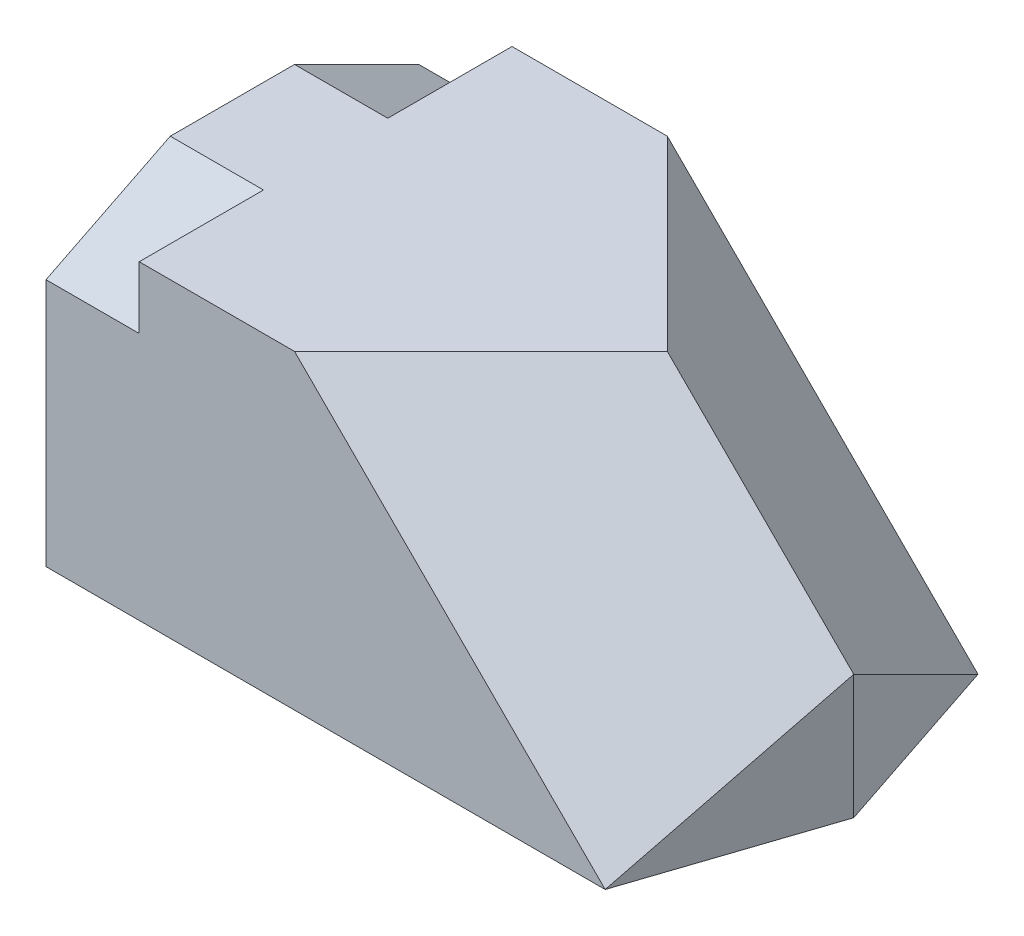
ISO-10303-21;
HEADER;
FILE_DESCRIPTION(('STEP AP214'),'2;1');
FILE_NAME('part.step','',(''),(''),'','','');
FILE_SCHEMA(('AUTOMOTIVE_DESIGN { 1 0 10303 214 1 1 1 1 }'));
ENDSEC;
DATA;
#1=APPLICATION_CONTEXT('core data for automotive mechanical design processes');
#2=APPLICATION_PROTOCOL_DEFINITION('international standard','automotive_design',2000,#1);
#3=PRODUCT_CONTEXT('',#1,'mechanical');
#4=PRODUCT('Part','Part','',(#3));
#5=PRODUCT_RELATED_PRODUCT_CATEGORY('part','',(#4));
#6=PRODUCT_DEFINITION_FORMATION('','',#4);
#7=PRODUCT_DEFINITION_CONTEXT('part definition',#1,'design');
#8=PRODUCT_DEFINITION('design','',#6,#7);
#9=PRODUCT_DEFINITION_SHAPE('','',#8);
#10=(LENGTH_UNIT() NAMED_UNIT(*) SI_UNIT(.MILLI.,.METRE.));
#11=(NAMED_UNIT(*) PLANE_ANGLE_UNIT() SI_UNIT($,.RADIAN.));
#12=(NAMED_UNIT(*) SI_UNIT($,.STERADIAN.) SOLID_ANGLE_UNIT());
#13=UNCERTAINTY_MEASURE_WITH_UNIT(LENGTH_MEASURE(1.E-05),#10,'distance_accuracy_value','');
#14=(GEOMETRIC_REPRESENTATION_CONTEXT(3) GLOBAL_UNCERTAINTY_ASSIGNED_CONTEXT((#13)) GLOBAL_UNIT_ASSIGNED_CONTEXT((#10,
#11,#12)) REPRESENTATION_CONTEXT('',''));
#15=CARTESIAN_POINT('',(0.,0.,0.));
#16=DIRECTION('',(0.,0.,1.));
#17=DIRECTION('',(1.,0.,0.));
#18=AXIS2_PLACEMENT_3D('',#15,#16,#17);
#19=CARTESIAN_POINT('',(0.,0.,30.));
#20=DIRECTION('',(0.,1.,0.));
#21=DIRECTION('',(0.,0.,1.));
#22=AXIS2_PLACEMENT_3D('',#19,#20,#21);
#23=PLANE('',#22);
#24=DIRECTION('',(1.,0.,0.));
#25=VECTOR('',#24,1.);
#26=CARTESIAN_POINT('',(0.,0.,-30.));
#27=LINE('',#26,#25);
#28=CARTESIAN_POINT('',(0.,0.,-30.));
#29=VERTEX_POINT('',#28);
#30=CARTESIAN_POINT('',(90.,0.,-30.));
#31=VERTEX_POINT('',#30);
#32=EDGE_CURVE('E182',#29,#31,#27,.T.);
#33=ORIENTED_EDGE('',*,*,#32,.T.);
#34=DIRECTION('',(-0.316227766016838,0.,-0.948683298050514));
#35=VECTOR('',#34,1.);
#36=CARTESIAN_POINT('',(100.,0.,0.));
#37=LINE('',#36,#35);
#38=CARTESIAN_POINT('',(100.,0.,0.));
#39=VERTEX_POINT('',#38);
#40=EDGE_CURVE('E153',#39,#31,#37,.T.);
#41=ORIENTED_EDGE('',*,*,#40,.F.);
#42=DIRECTION('',(-0.316227766016838,0.,0.948683298050514));
#43=VECTOR('',#42,1.);
#44=CARTESIAN_POINT('',(100.,0.,0.));
#45=LINE('',#44,#43);
#46=CARTESIAN_POINT('',(90.,0.,30.));
#47=VERTEX_POINT('',#46);
#48=EDGE_CURVE('E160',#39,#47,#45,.T.);
#49=ORIENTED_EDGE('',*,*,#48,.T.);
#50=DIRECTION('',(1.,0.,0.));
#51=VECTOR('',#50,1.);
#52=CARTESIAN_POINT('',(0.,0.,30.));
#53=LINE('',#52,#51);
#54=CARTESIAN_POINT('',(0.,0.,30.));
#55=VERTEX_POINT('',#54);
#56=EDGE_CURVE('E173',#55,#47,#53,.T.);
#57=ORIENTED_EDGE('',*,*,#56,.F.);
#58=DIRECTION('',(0.,0.,-1.));
#59=VECTOR('',#58,1.);
#60=CARTESIAN_POINT('',(0.,0.,30.));
#61=LINE('',#60,#59);
#62=EDGE_CURVE('E188',#55,#29,#61,.T.);
#63=ORIENTED_EDGE('',*,*,#62,.T.);
#64=EDGE_LOOP('',(#33,#41,#49,#57,#63));
#65=FACE_BOUND('',#64,.T.);
#66=ADVANCED_FACE('F39',(#65),#23,.F.);
#67=CARTESIAN_POINT('',(0.,50.,30.));
#68=DIRECTION('',(0.,-1.,0.));
#69=DIRECTION('',(0.,0.,-1.));
#70=AXIS2_PLACEMENT_3D('',#67,#68,#69);
#71=PLANE('',#70);
#72=DIRECTION('',(0.,0.,-1.));
#73=VECTOR('',#72,1.);
#74=CARTESIAN_POINT('',(15.,50.,-10.));
#75=LINE('',#74,#73);
#76=CARTESIAN_POINT('',(15.,50.,-10.));
#77=VERTEX_POINT('',#76);
#78=CARTESIAN_POINT('',(15.,50.,-30.));
#79=VERTEX_POINT('',#78);
#80=EDGE_CURVE('E62',#77,#79,#75,.T.);
#81=ORIENTED_EDGE('',*,*,#80,.F.);
#82=DIRECTION('',(-1.,0.,0.));
#83=VECTOR('',#82,1.);
#84=CARTESIAN_POINT('',(15.,50.,-10.));
#85=LINE('',#84,#83);
#86=CARTESIAN_POINT('',(0.,50.,-10.));
#87=VERTEX_POINT('',#86);
#88=EDGE_CURVE('E120',#77,#87,#85,.T.);
#89=ORIENTED_EDGE('',*,*,#88,.T.);
#90=DIRECTION('',(0.,0.,-1.));
#91=VECTOR('',#90,1.);
#92=CARTESIAN_POINT('',(0.,50.,30.));
#93=LINE('',#92,#91);
#94=CARTESIAN_POINT('',(0.,50.,10.));
#95=VERTEX_POINT('',#94);
#96=EDGE_CURVE('E180',#95,#87,#93,.T.);
#97=ORIENTED_EDGE('',*,*,#96,.F.);
#98=DIRECTION('',(-1.,0.,0.));
#99=VECTOR('',#98,1.);
#100=CARTESIAN_POINT('',(15.,50.,10.));
#101=LINE('',#100,#99);
#102=CARTESIAN_POINT('',(15.,50.,10.));
#103=VERTEX_POINT('',#102);
#104=EDGE_CURVE('E54',#103,#95,#101,.T.);
#105=ORIENTED_EDGE('',*,*,#104,.F.);
#106=DIRECTION('',(0.,0.,-1.));
#107=VECTOR('',#106,1.);
#108=CARTESIAN_POINT('',(15.,50.,10.));
#109=LINE('',#108,#107);
#110=CARTESIAN_POINT('',(15.,50.,30.));
#111=VERTEX_POINT('',#110);
#112=EDGE_CURVE('E141',#111,#103,#109,.T.);
#113=ORIENTED_EDGE('',*,*,#112,.F.);
#114=DIRECTION('',(-1.,0.,0.));
#115=VECTOR('',#114,1.);
#116=CARTESIAN_POINT('',(0.,50.,30.));
#117=LINE('',#116,#115);
#118=CARTESIAN_POINT('',(40.,50.,30.));
#119=VERTEX_POINT('',#118);
#120=EDGE_CURVE('E177',#119,#111,#117,.T.);
#121=ORIENTED_EDGE('',*,*,#120,.F.);
#122=DIRECTION('',(0.707106781186548,0.,-0.707106781186548));
#123=VECTOR('',#122,1.);
#124=CARTESIAN_POINT('',(35.,50.,35.));
#125=LINE('',#124,#123);
#126=CARTESIAN_POINT('',(70.,50.,0.));
#127=VERTEX_POINT('',#126);
#128=EDGE_CURVE('E166',#119,#127,#125,.T.);
#129=ORIENTED_EDGE('',*,*,#128,.T.);
#130=DIRECTION('',(0.707106781186548,0.,0.707106781186548));
#131=VECTOR('',#130,1.);
#132=CARTESIAN_POINT('',(35.,50.,-35.));
#133=LINE('',#132,#131);
#134=CARTESIAN_POINT('',(40.,50.,-30.));
#135=VERTEX_POINT('',#134);
#136=EDGE_CURVE('E163',#135,#127,#133,.T.);
#137=ORIENTED_EDGE('',*,*,#136,.F.);
#138=DIRECTION('',(-1.,0.,0.));
#139=VECTOR('',#138,1.);
#140=CARTESIAN_POINT('',(0.,50.,-30.));
#141=LINE('',#140,#139);
#142=EDGE_CURVE('E174',#135,#79,#141,.T.);
#143=ORIENTED_EDGE('',*,*,#142,.T.);
#144=EDGE_LOOP('',(#81,#89,#97,#105,#113,#121,#129,#137,#143));
#145=FACE_BOUND('',#144,.T.);
#146=ADVANCED_FACE('F197',(#145),#71,.F.);
#147=CARTESIAN_POINT('',(0.,0.,30.));
#148=DIRECTION('',(0.,0.,-1.));
#149=DIRECTION('',(-1.,0.,0.));
#150=AXIS2_PLACEMENT_3D('',#147,#148,#149);
#151=PLANE('',#150);
#152=DIRECTION('',(0.,1.,0.));
#153=VECTOR('',#152,1.);
#154=CARTESIAN_POINT('',(15.,50.,30.));
#155=LINE('',#154,#153);
#156=CARTESIAN_POINT('',(15.,40.,30.));
#157=VERTEX_POINT('',#156);
#158=EDGE_CURVE('E139',#157,#111,#155,.T.);
#159=ORIENTED_EDGE('',*,*,#158,.F.);
#160=DIRECTION('',(-1.,0.,0.));
#161=VECTOR('',#160,1.);
#162=CARTESIAN_POINT('',(15.,40.,30.));
#163=LINE('',#162,#161);
#164=CARTESIAN_POINT('',(0.,40.,30.));
#165=VERTEX_POINT('',#164);
#166=EDGE_CURVE('E148',#157,#165,#163,.T.);
#167=ORIENTED_EDGE('',*,*,#166,.T.);
#168=DIRECTION('',(0.,-1.,0.));
#169=VECTOR('',#168,1.);
#170=CARTESIAN_POINT('',(0.,0.,30.));
#171=LINE('',#170,#169);
#172=EDGE_CURVE('E171',#165,#55,#171,.T.);
#173=ORIENTED_EDGE('',*,*,#172,.T.);
#174=ORIENTED_EDGE('',*,*,#56,.T.);
#175=DIRECTION('',(0.707106781186547,-0.707106781186548,0.));
#176=VECTOR('',#175,1.);
#177=CARTESIAN_POINT('',(45.,45.,30.));
#178=LINE('',#177,#176);
#179=EDGE_CURVE('E11',#119,#47,#178,.T.);
#180=ORIENTED_EDGE('',*,*,#179,.F.);
#181=ORIENTED_EDGE('',*,*,#120,.T.);
#182=EDGE_LOOP('',(#159,#167,#173,#174,#180,#181));
#183=FACE_BOUND('',#182,.T.);
#184=ADVANCED_FACE('F205',(#183),#151,.F.);
#185=CARTESIAN_POINT('',(0.,0.,30.));
#186=DIRECTION('',(1.,0.,0.));
#187=DIRECTION('',(0.,0.,-1.));
#188=AXIS2_PLACEMENT_3D('',#185,#186,#187);
#189=PLANE('',#188);
#190=ORIENTED_EDGE('',*,*,#96,.T.);
#191=DIRECTION('',(0.,0.447213595499958,0.894427190999916));
#192=VECTOR('',#191,1.);
#193=CARTESIAN_POINT('',(0.,40.,-30.));
#194=LINE('',#193,#192);
#195=CARTESIAN_POINT('',(0.,40.,-30.));
#196=VERTEX_POINT('',#195);
#197=EDGE_CURVE('E127',#196,#87,#194,.T.);
#198=ORIENTED_EDGE('',*,*,#197,.F.);
#199=DIRECTION('',(0.,-1.,0.));
#200=VECTOR('',#199,1.);
#201=CARTESIAN_POINT('',(0.,0.,-30.));
#202=LINE('',#201,#200);
#203=EDGE_CURVE('E132',#196,#29,#202,.T.);
#204=ORIENTED_EDGE('',*,*,#203,.T.);
#205=ORIENTED_EDGE('',*,*,#62,.F.);
#206=ORIENTED_EDGE('',*,*,#172,.F.);
#207=DIRECTION('',(0.,-0.447213595499958,0.894427190999916));
#208=VECTOR('',#207,1.);
#209=CARTESIAN_POINT('',(0.,40.,30.));
#210=LINE('',#209,#208);
#211=EDGE_CURVE('E142',#95,#165,#210,.T.);
#212=ORIENTED_EDGE('',*,*,#211,.F.);
#213=EDGE_LOOP('',(#190,#198,#204,#205,#206,#212));
#214=FACE_BOUND('',#213,.T.);
#215=ADVANCED_FACE('F41',(#214),#189,.F.);
#216=CARTESIAN_POINT('',(0.,0.,-30.));
#217=DIRECTION('',(0.,0.,-1.));
#218=DIRECTION('',(-1.,0.,0.));
#219=AXIS2_PLACEMENT_3D('',#216,#217,#218);
#220=PLANE('',#219);
#221=DIRECTION('',(-1.,0.,0.));
#222=VECTOR('',#221,1.);
#223=CARTESIAN_POINT('',(15.,40.,-30.));
#224=LINE('',#223,#222);
#225=CARTESIAN_POINT('',(15.,40.,-30.));
#226=VERTEX_POINT('',#225);
#227=EDGE_CURVE('E117',#226,#196,#224,.T.);
#228=ORIENTED_EDGE('',*,*,#227,.F.);
#229=DIRECTION('',(0.,-1.,0.));
#230=VECTOR('',#229,1.);
#231=CARTESIAN_POINT('',(15.,50.,-30.));
#232=LINE('',#231,#230);
#233=EDGE_CURVE('E121',#79,#226,#232,.T.);
#234=ORIENTED_EDGE('',*,*,#233,.F.);
#235=ORIENTED_EDGE('',*,*,#142,.F.);
#236=DIRECTION('',(-0.707106781186547,0.707106781186548,0.));
#237=VECTOR('',#236,1.);
#238=CARTESIAN_POINT('',(45.,45.,-30.));
#239=LINE('',#238,#237);
#240=EDGE_CURVE('E47',#31,#135,#239,.T.);
#241=ORIENTED_EDGE('',*,*,#240,.F.);
#242=ORIENTED_EDGE('',*,*,#32,.F.);
#243=ORIENTED_EDGE('',*,*,#203,.F.);
#244=EDGE_LOOP('',(#228,#234,#235,#241,#242,#243));
#245=FACE_BOUND('',#244,.T.);
#246=ADVANCED_FACE('F130',(#245),#220,.T.);
#247=CARTESIAN_POINT('',(90.,-5.,35.));
#248=DIRECTION('',(0.577350269189626,0.577350269189626,0.577350269189626));
#249=DIRECTION('',(0.707106781186547,0.,-0.707106781186547));
#250=AXIS2_PLACEMENT_3D('',#247,#248,#249);
#251=PLANE('',#250);
#252=DIRECTION('',(0.267261241912425,0.534522483824849,-0.801783725737273));
#253=VECTOR('',#252,1.);
#254=CARTESIAN_POINT('',(90.,0.,30.));
#255=LINE('',#254,#253);
#256=CARTESIAN_POINT('',(100.,20.,0.));
#257=VERTEX_POINT('',#256);
#258=EDGE_CURVE('E155',#47,#257,#255,.T.);
#259=ORIENTED_EDGE('',*,*,#258,.T.);
#260=DIRECTION('',(-0.707106781186547,0.707106781186548,0.));
#261=VECTOR('',#260,1.);
#262=CARTESIAN_POINT('',(125.,-5.,0.));
#263=LINE('',#262,#261);
#264=EDGE_CURVE('E169',#257,#127,#263,.T.);
#265=ORIENTED_EDGE('',*,*,#264,.T.);
#266=ORIENTED_EDGE('',*,*,#128,.F.);
#267=ORIENTED_EDGE('',*,*,#179,.T.);
#268=EDGE_LOOP('',(#259,#265,#266,#267));
#269=FACE_BOUND('',#268,.T.);
#270=ADVANCED_FACE('F202',(#269),#251,.T.);
#271=CARTESIAN_POINT('',(90.,-5.,-35.));
#272=DIRECTION('',(-0.577350269189626,-0.577350269189626,0.577350269189626));
#273=DIRECTION('',(0.707106781186547,0.,0.707106781186547));
#274=AXIS2_PLACEMENT_3D('',#271,#272,#273);
#275=PLANE('',#274);
#276=ORIENTED_EDGE('',*,*,#264,.F.);
#277=DIRECTION('',(0.267261241912425,0.534522483824849,0.801783725737273));
#278=VECTOR('',#277,1.);
#279=CARTESIAN_POINT('',(90.,0.,-30.));
#280=LINE('',#279,#278);
#281=EDGE_CURVE('E134',#31,#257,#280,.T.);
#282=ORIENTED_EDGE('',*,*,#281,.F.);
#283=ORIENTED_EDGE('',*,*,#240,.T.);
#284=ORIENTED_EDGE('',*,*,#136,.T.);
#285=EDGE_LOOP('',(#276,#282,#283,#284));
#286=FACE_BOUND('',#285,.T.);
#287=ADVANCED_FACE('F195',(#286),#275,.F.);
#288=CARTESIAN_POINT('',(90.,0.,30.));
#289=DIRECTION('',(-0.948683298050514,0.,-0.316227766016838));
#290=DIRECTION('',(-0.316227766016838,0.,0.948683298050514));
#291=AXIS2_PLACEMENT_3D('',#288,#289,#290);
#292=PLANE('',#291);
#293=ORIENTED_EDGE('',*,*,#258,.F.);
#294=ORIENTED_EDGE('',*,*,#48,.F.);
#295=DIRECTION('',(0.,-1.,0.));
#296=VECTOR('',#295,1.);
#297=CARTESIAN_POINT('',(100.,20.,0.));
#298=LINE('',#297,#296);
#299=EDGE_CURVE('E158',#257,#39,#298,.T.);
#300=ORIENTED_EDGE('',*,*,#299,.F.);
#301=EDGE_LOOP('',(#293,#294,#300));
#302=FACE_BOUND('',#301,.T.);
#303=ADVANCED_FACE('F216',(#302),#292,.F.);
#304=CARTESIAN_POINT('',(90.,0.,-30.));
#305=DIRECTION('',(-0.948683298050514,0.,0.316227766016838));
#306=DIRECTION('',(-0.316227766016838,0.,-0.948683298050514));
#307=AXIS2_PLACEMENT_3D('',#304,#305,#306);
#308=PLANE('',#307);
#309=ORIENTED_EDGE('',*,*,#281,.T.);
#310=ORIENTED_EDGE('',*,*,#299,.T.);
#311=ORIENTED_EDGE('',*,*,#40,.T.);
#312=EDGE_LOOP('',(#309,#310,#311));
#313=FACE_BOUND('',#312,.T.);
#314=ADVANCED_FACE('F217',(#313),#308,.F.);
#315=CARTESIAN_POINT('',(15.,40.,-30.));
#316=DIRECTION('',(0.,-0.894427190999916,0.447213595499958));
#317=DIRECTION('',(0.,-0.447213595499958,-0.894427190999916));
#318=AXIS2_PLACEMENT_3D('',#315,#316,#317);
#319=PLANE('',#318);
#320=ORIENTED_EDGE('',*,*,#197,.T.);
#321=ORIENTED_EDGE('',*,*,#88,.F.);
#322=DIRECTION('',(0.,0.447213595499958,0.894427190999916));
#323=VECTOR('',#322,1.);
#324=CARTESIAN_POINT('',(15.,40.,-30.));
#325=LINE('',#324,#323);
#326=EDGE_CURVE('E114',#226,#77,#325,.T.);
#327=ORIENTED_EDGE('',*,*,#326,.F.);
#328=ORIENTED_EDGE('',*,*,#227,.T.);
#329=EDGE_LOOP('',(#320,#321,#327,#328));
#330=FACE_BOUND('',#329,.T.);
#331=ADVANCED_FACE('F115',(#330),#319,.F.);
#332=CARTESIAN_POINT('',(15.,0.,0.));
#333=DIRECTION('',(1.,0.,0.));
#334=DIRECTION('',(0.,0.,-1.));
#335=AXIS2_PLACEMENT_3D('',#332,#333,#334);
#336=PLANE('',#335);
#337=ORIENTED_EDGE('',*,*,#233,.T.);
#338=ORIENTED_EDGE('',*,*,#326,.T.);
#339=ORIENTED_EDGE('',*,*,#80,.T.);
#340=EDGE_LOOP('',(#337,#338,#339));
#341=FACE_BOUND('',#340,.T.);
#342=ADVANCED_FACE('F123',(#341),#336,.F.);
#343=CARTESIAN_POINT('',(15.,40.,30.));
#344=DIRECTION('',(0.,-0.894427190999916,-0.447213595499958));
#345=DIRECTION('',(0.,0.447213595499958,-0.894427190999916));
#346=AXIS2_PLACEMENT_3D('',#343,#344,#345);
#347=PLANE('',#346);
#348=ORIENTED_EDGE('',*,*,#211,.T.);
#349=ORIENTED_EDGE('',*,*,#166,.F.);
#350=DIRECTION('',(0.,-0.447213595499958,0.894427190999916));
#351=VECTOR('',#350,1.);
#352=CARTESIAN_POINT('',(15.,40.,30.));
#353=LINE('',#352,#351);
#354=EDGE_CURVE('E144',#103,#157,#353,.T.);
#355=ORIENTED_EDGE('',*,*,#354,.F.);
#356=ORIENTED_EDGE('',*,*,#104,.T.);
#357=EDGE_LOOP('',(#348,#349,#355,#356));
#358=FACE_BOUND('',#357,.T.);
#359=ADVANCED_FACE('F295',(#358),#347,.F.);
#360=CARTESIAN_POINT('',(15.,0.,0.));
#361=DIRECTION('',(-1.,0.,0.));
#362=DIRECTION('',(0.,0.,1.));
#363=AXIS2_PLACEMENT_3D('',#360,#361,#362);
#364=PLANE('',#363);
#365=ORIENTED_EDGE('',*,*,#158,.T.);
#366=ORIENTED_EDGE('',*,*,#112,.T.);
#367=ORIENTED_EDGE('',*,*,#354,.T.);
#368=EDGE_LOOP('',(#365,#366,#367));
#369=FACE_BOUND('',#368,.T.);
#370=ADVANCED_FACE('F304',(#369),#364,.T.);
#371=CLOSED_SHELL('',(#66,#146,#184,#215,#246,#270,#287,#303,#314,#331,#342,#359,#370));
#372=MANIFOLD_SOLID_BREP('B2',#371);
#373=ADVANCED_BREP_SHAPE_REPRESENTATION('',(#18,#372),#14);
#374=SHAPE_DEFINITION_REPRESENTATION(#9,#373);
ENDSEC;
END-ISO-10303-21;
